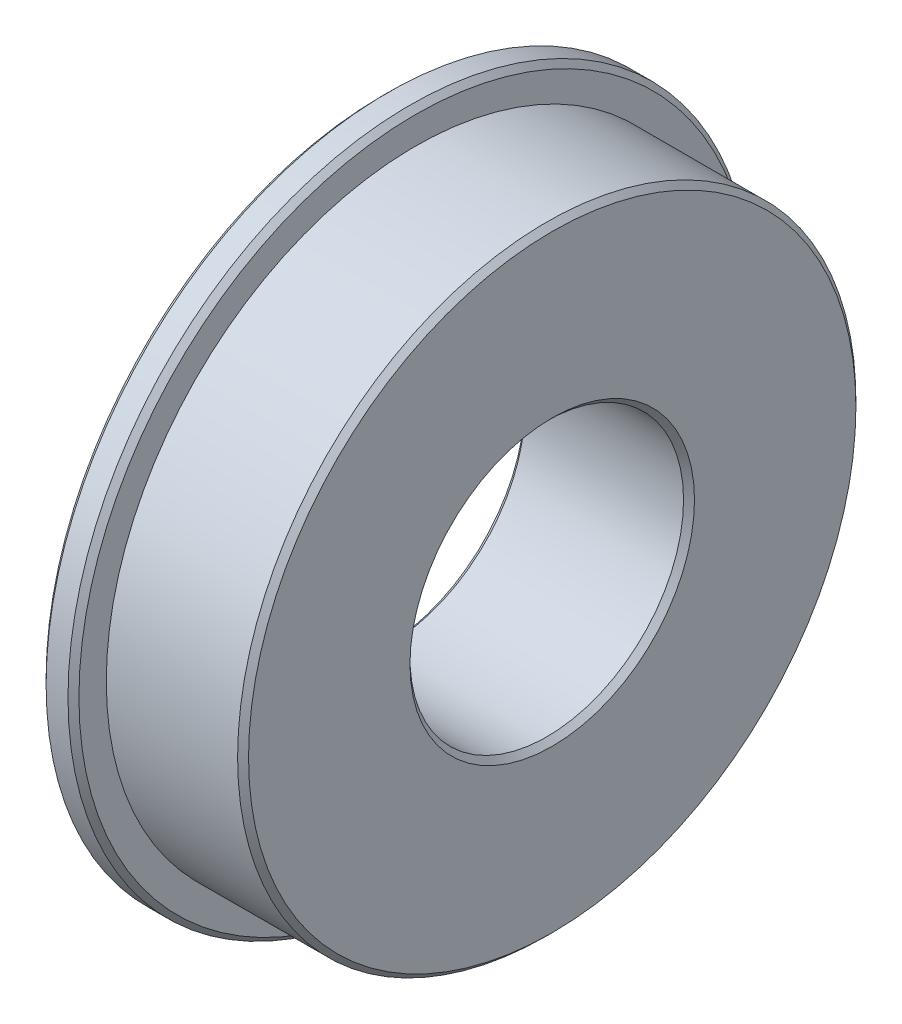
ISO-10303-21;
HEADER;
FILE_DESCRIPTION(('STEP AP214'),'2;1');
FILE_NAME('part.step','',(''),(''),'','','');
FILE_SCHEMA(('AUTOMOTIVE_DESIGN { 1 0 10303 214 1 1 1 1 }'));
ENDSEC;
DATA;
#1=APPLICATION_CONTEXT('core data for automotive mechanical design processes');
#2=APPLICATION_PROTOCOL_DEFINITION('international standard','automotive_design',2000,#1);
#3=PRODUCT_CONTEXT('',#1,'mechanical');
#4=PRODUCT('Part','Part','',(#3));
#5=PRODUCT_RELATED_PRODUCT_CATEGORY('part','',(#4));
#6=PRODUCT_DEFINITION_FORMATION('','',#4);
#7=PRODUCT_DEFINITION_CONTEXT('part definition',#1,'design');
#8=PRODUCT_DEFINITION('design','',#6,#7);
#9=PRODUCT_DEFINITION_SHAPE('','',#8);
#10=(LENGTH_UNIT() NAMED_UNIT(*) SI_UNIT(.MILLI.,.METRE.));
#11=(NAMED_UNIT(*) PLANE_ANGLE_UNIT() SI_UNIT($,.RADIAN.));
#12=(NAMED_UNIT(*) SI_UNIT($,.STERADIAN.) SOLID_ANGLE_UNIT());
#13=UNCERTAINTY_MEASURE_WITH_UNIT(LENGTH_MEASURE(1.E-05),#10,'distance_accuracy_value','');
#14=(GEOMETRIC_REPRESENTATION_CONTEXT(3) GLOBAL_UNCERTAINTY_ASSIGNED_CONTEXT((#13)) GLOBAL_UNIT_ASSIGNED_CONTEXT((#10,
#11,#12)) REPRESENTATION_CONTEXT('',''));
#15=CARTESIAN_POINT('',(0.,0.,0.));
#16=DIRECTION('',(0.,0.,1.));
#17=DIRECTION('',(1.,0.,0.));
#18=AXIS2_PLACEMENT_3D('',#15,#16,#17);
#19=CARTESIAN_POINT('',(7.61999999999999,0.,0.));
#20=DIRECTION('',(-1.,0.,0.));
#21=DIRECTION('',(0.,-1.,0.));
#22=AXIS2_PLACEMENT_3D('',#19,#20,#21);
#23=CONICAL_SURFACE('',#22,14.351,0.785398163397438);
#24=CARTESIAN_POINT('',(7.61999999999999,0.,0.));
#25=DIRECTION('',(-1.,0.,0.));
#26=DIRECTION('',(0.,0.,1.));
#27=AXIS2_PLACEMENT_3D('',#24,#25,#26);
#28=CIRCLE('',#27,14.351);
#29=CARTESIAN_POINT('',(7.61999999999999,0.,14.351));
#30=VERTEX_POINT('',#29);
#31=EDGE_CURVE('E29',#30,#30,#28,.T.);
#32=ORIENTED_EDGE('',*,*,#31,.F.);
#33=EDGE_LOOP('',(#32));
#34=FACE_BOUND('',#33,.T.);
#35=CARTESIAN_POINT('',(7.874,0.,0.));
#36=DIRECTION('',(-1.,0.,0.));
#37=DIRECTION('',(0.,-1.,0.));
#38=AXIS2_PLACEMENT_3D('',#35,#36,#37);
#39=CIRCLE('',#38,14.097);
#40=CARTESIAN_POINT('',(7.874,-14.097,0.));
#41=VERTEX_POINT('',#40);
#42=EDGE_CURVE('E17',#41,#41,#39,.F.);
#43=ORIENTED_EDGE('',*,*,#42,.F.);
#44=EDGE_LOOP('',(#43));
#45=FACE_BOUND('',#44,.T.);
#46=ADVANCED_FACE('F14',(#34,#45),#23,.T.);
#47=CARTESIAN_POINT('',(7.874,0.,0.));
#48=DIRECTION('',(-1.,0.,0.));
#49=DIRECTION('',(0.,0.,1.));
#50=AXIS2_PLACEMENT_3D('',#47,#48,#49);
#51=CYLINDRICAL_SURFACE('',#50,14.351);
#52=CARTESIAN_POINT('',(1.524,0.,0.));
#53=DIRECTION('',(-1.,0.,0.));
#54=DIRECTION('',(0.,0.,1.));
#55=AXIS2_PLACEMENT_3D('',#52,#53,#54);
#56=CIRCLE('',#55,14.351);
#57=CARTESIAN_POINT('',(1.524,0.,14.351));
#58=VERTEX_POINT('',#57);
#59=EDGE_CURVE('E38',#58,#58,#56,.T.);
#60=ORIENTED_EDGE('',*,*,#59,.F.);
#61=EDGE_LOOP('',(#60));
#62=FACE_BOUND('',#61,.T.);
#63=ORIENTED_EDGE('',*,*,#31,.T.);
#64=EDGE_LOOP('',(#63));
#65=FACE_BOUND('',#64,.T.);
#66=ADVANCED_FACE('F48',(#62,#65),#51,.T.);
#67=CARTESIAN_POINT('',(7.874,0.,0.));
#68=DIRECTION('',(1.,0.,0.));
#69=DIRECTION('',(0.,0.,-1.));
#70=AXIS2_PLACEMENT_3D('',#67,#68,#69);
#71=PLANE('',#70);
#72=CARTESIAN_POINT('',(7.87399999995841,0.,0.));
#73=DIRECTION('',(1.,0.,0.));
#74=DIRECTION('',(0.,0.,-1.));
#75=AXIS2_PLACEMENT_3D('',#72,#73,#74);
#76=CIRCLE('',#75,6.60399999992478);
#77=CARTESIAN_POINT('',(7.87399999995841,0.,-6.60399999992478));
#78=VERTEX_POINT('',#77);
#79=EDGE_CURVE('E36',#78,#78,#76,.F.);
#80=ORIENTED_EDGE('',*,*,#79,.T.);
#81=EDGE_LOOP('',(#80));
#82=FACE_BOUND('',#81,.T.);
#83=ORIENTED_EDGE('',*,*,#42,.T.);
#84=EDGE_LOOP('',(#83));
#85=FACE_BOUND('',#84,.T.);
#86=ADVANCED_FACE('F56',(#82,#85),#71,.T.);
#87=CARTESIAN_POINT('',(1.524,0.,0.));
#88=DIRECTION('',(1.,0.,0.));
#89=DIRECTION('',(0.,0.,-1.));
#90=AXIS2_PLACEMENT_3D('',#87,#88,#89);
#91=PLANE('',#90);
#92=ORIENTED_EDGE('',*,*,#59,.T.);
#93=EDGE_LOOP('',(#92));
#94=FACE_BOUND('',#93,.T.);
#95=CARTESIAN_POINT('',(1.524,0.,0.));
#96=DIRECTION('',(-1.,0.,0.));
#97=DIRECTION('',(0.,0.,1.));
#98=AXIS2_PLACEMENT_3D('',#95,#96,#97);
#99=CIRCLE('',#98,15.621);
#100=CARTESIAN_POINT('',(1.524,0.,15.621));
#101=VERTEX_POINT('',#100);
#102=EDGE_CURVE('E32',#101,#101,#99,.T.);
#103=ORIENTED_EDGE('',*,*,#102,.F.);
#104=EDGE_LOOP('',(#103));
#105=FACE_BOUND('',#104,.T.);
#106=ADVANCED_FACE('F89',(#94,#105),#91,.T.);
#107=CARTESIAN_POINT('',(7.87399999990157,0.,0.));
#108=DIRECTION('',(1.,0.,0.));
#109=DIRECTION('',(0.,0.,-1.));
#110=AXIS2_PLACEMENT_3D('',#107,#108,#109);
#111=CONICAL_SURFACE('',#110,6.60399999986794,0.785398163509345);
#112=ORIENTED_EDGE('',*,*,#79,.F.);
#113=EDGE_LOOP('',(#112));
#114=FACE_BOUND('',#113,.T.);
#115=CARTESIAN_POINT('',(7.62,0.,0.));
#116=DIRECTION('',(1.,0.,0.));
#117=DIRECTION('',(0.,0.,-1.));
#118=AXIS2_PLACEMENT_3D('',#115,#116,#117);
#119=CIRCLE('',#118,6.35);
#120=CARTESIAN_POINT('',(7.62,0.,-6.35));
#121=VERTEX_POINT('',#120);
#122=EDGE_CURVE('E35',#121,#121,#119,.F.);
#123=ORIENTED_EDGE('',*,*,#122,.T.);
#124=EDGE_LOOP('',(#123));
#125=FACE_BOUND('',#124,.T.);
#126=ADVANCED_FACE('F85',(#114,#125),#111,.F.);
#127=CARTESIAN_POINT('',(1.27000000000003,0.,0.));
#128=DIRECTION('',(-1.,0.,0.));
#129=DIRECTION('',(0.,0.,1.));
#130=AXIS2_PLACEMENT_3D('',#127,#128,#129);
#131=CONICAL_SURFACE('',#130,15.875,0.785398163397443);
#132=ORIENTED_EDGE('',*,*,#102,.T.);
#133=EDGE_LOOP('',(#132));
#134=FACE_BOUND('',#133,.T.);
#135=CARTESIAN_POINT('',(1.27000000000003,0.,0.));
#136=DIRECTION('',(-1.,0.,0.));
#137=DIRECTION('',(0.,0.,1.));
#138=AXIS2_PLACEMENT_3D('',#135,#136,#137);
#139=CIRCLE('',#138,15.875);
#140=CARTESIAN_POINT('',(1.27000000000003,0.,15.875));
#141=VERTEX_POINT('',#140);
#142=EDGE_CURVE('E101',#141,#141,#139,.T.);
#143=ORIENTED_EDGE('',*,*,#142,.F.);
#144=EDGE_LOOP('',(#143));
#145=FACE_BOUND('',#144,.T.);
#146=ADVANCED_FACE('F81',(#134,#145),#131,.T.);
#147=CARTESIAN_POINT('',(0.,0.,0.));
#148=DIRECTION('',(1.,0.,0.));
#149=DIRECTION('',(0.,0.,-1.));
#150=AXIS2_PLACEMENT_3D('',#147,#148,#149);
#151=CYLINDRICAL_SURFACE('',#150,6.35);
#152=ORIENTED_EDGE('',*,*,#122,.F.);
#153=EDGE_LOOP('',(#152));
#154=FACE_BOUND('',#153,.T.);
#155=CARTESIAN_POINT('',(0.254000000040833,0.,0.));
#156=DIRECTION('',(-1.,0.,0.));
#157=DIRECTION('',(0.,0.,1.));
#158=AXIS2_PLACEMENT_3D('',#155,#156,#157);
#159=CIRCLE('',#158,6.34999999999764);
#160=CARTESIAN_POINT('',(0.254000000040833,0.,6.34999999999764));
#161=VERTEX_POINT('',#160);
#162=EDGE_CURVE('E103',#161,#161,#159,.T.);
#163=ORIENTED_EDGE('',*,*,#162,.T.);
#164=EDGE_LOOP('',(#163));
#165=FACE_BOUND('',#164,.T.);
#166=ADVANCED_FACE('F77',(#154,#165),#151,.F.);
#167=CARTESIAN_POINT('',(1.524,0.,0.));
#168=DIRECTION('',(-1.,0.,0.));
#169=DIRECTION('',(0.,0.,1.));
#170=AXIS2_PLACEMENT_3D('',#167,#168,#169);
#171=CYLINDRICAL_SURFACE('',#170,15.875);
#172=ORIENTED_EDGE('',*,*,#142,.T.);
#173=EDGE_LOOP('',(#172));
#174=FACE_BOUND('',#173,.T.);
#175=CARTESIAN_POINT('',(0.254000000000008,0.,0.));
#176=DIRECTION('',(1.,0.,0.));
#177=DIRECTION('',(0.,0.,-1.));
#178=AXIS2_PLACEMENT_3D('',#175,#176,#177);
#179=CIRCLE('',#178,15.875);
#180=CARTESIAN_POINT('',(0.254000000000008,0.,-15.875));
#181=VERTEX_POINT('',#180);
#182=EDGE_CURVE('E26',#181,#181,#179,.F.);
#183=ORIENTED_EDGE('',*,*,#182,.F.);
#184=EDGE_LOOP('',(#183));
#185=FACE_BOUND('',#184,.T.);
#186=ADVANCED_FACE('F73',(#174,#185),#171,.T.);
#187=CARTESIAN_POINT('',(5.6843418860808E-11,0.,0.));
#188=DIRECTION('',(-1.,0.,0.));
#189=DIRECTION('',(0.,0.,1.));
#190=AXIS2_PLACEMENT_3D('',#187,#188,#189);
#191=CONICAL_SURFACE('',#190,6.60399999998162,0.785398163509345);
#192=CARTESIAN_POINT('',(0.,0.,0.));
#193=DIRECTION('',(-1.,0.,0.));
#194=DIRECTION('',(0.,0.,1.));
#195=AXIS2_PLACEMENT_3D('',#192,#193,#194);
#196=CIRCLE('',#195,6.60400000003847);
#197=CARTESIAN_POINT('',(0.,0.,6.60400000003847));
#198=VERTEX_POINT('',#197);
#199=EDGE_CURVE('E21',#198,#198,#196,.T.);
#200=ORIENTED_EDGE('',*,*,#199,.T.);
#201=EDGE_LOOP('',(#200));
#202=FACE_BOUND('',#201,.T.);
#203=ORIENTED_EDGE('',*,*,#162,.F.);
#204=EDGE_LOOP('',(#203));
#205=FACE_BOUND('',#204,.T.);
#206=ADVANCED_FACE('F67',(#202,#205),#191,.F.);
#207=CARTESIAN_POINT('',(0.254000000000008,0.,0.));
#208=DIRECTION('',(1.,0.,0.));
#209=DIRECTION('',(0.,0.,-1.));
#210=AXIS2_PLACEMENT_3D('',#207,#208,#209);
#211=CONICAL_SURFACE('',#210,15.875,0.785398163397449);
#212=CARTESIAN_POINT('',(0.,0.,0.));
#213=DIRECTION('',(1.,0.,0.));
#214=DIRECTION('',(0.,0.,-1.));
#215=AXIS2_PLACEMENT_3D('',#212,#213,#214);
#216=CIRCLE('',#215,15.621);
#217=CARTESIAN_POINT('',(0.,0.,-15.621));
#218=VERTEX_POINT('',#217);
#219=EDGE_CURVE('E10',#218,#218,#216,.T.);
#220=ORIENTED_EDGE('',*,*,#219,.T.);
#221=EDGE_LOOP('',(#220));
#222=FACE_BOUND('',#221,.T.);
#223=ORIENTED_EDGE('',*,*,#182,.T.);
#224=EDGE_LOOP('',(#223));
#225=FACE_BOUND('',#224,.T.);
#226=ADVANCED_FACE('F60',(#222,#225),#211,.T.);
#227=CARTESIAN_POINT('',(0.,0.,0.));
#228=DIRECTION('',(1.,0.,0.));
#229=DIRECTION('',(0.,0.,-1.));
#230=AXIS2_PLACEMENT_3D('',#227,#228,#229);
#231=PLANE('',#230);
#232=ORIENTED_EDGE('',*,*,#219,.F.);
#233=EDGE_LOOP('',(#232));
#234=FACE_BOUND('',#233,.T.);
#235=ORIENTED_EDGE('',*,*,#199,.F.);
#236=EDGE_LOOP('',(#235));
#237=FACE_BOUND('',#236,.T.);
#238=ADVANCED_FACE('F58',(#234,#237),#231,.F.);
#239=CLOSED_SHELL('',(#46,#66,#86,#106,#126,#146,#166,#186,#206,#226,#238));
#240=MANIFOLD_SOLID_BREP('B1',#239);
#241=ADVANCED_BREP_SHAPE_REPRESENTATION('',(#18,#240),#14);
#242=SHAPE_DEFINITION_REPRESENTATION(#9,#241);
ENDSEC;
END-ISO-10303-21;
